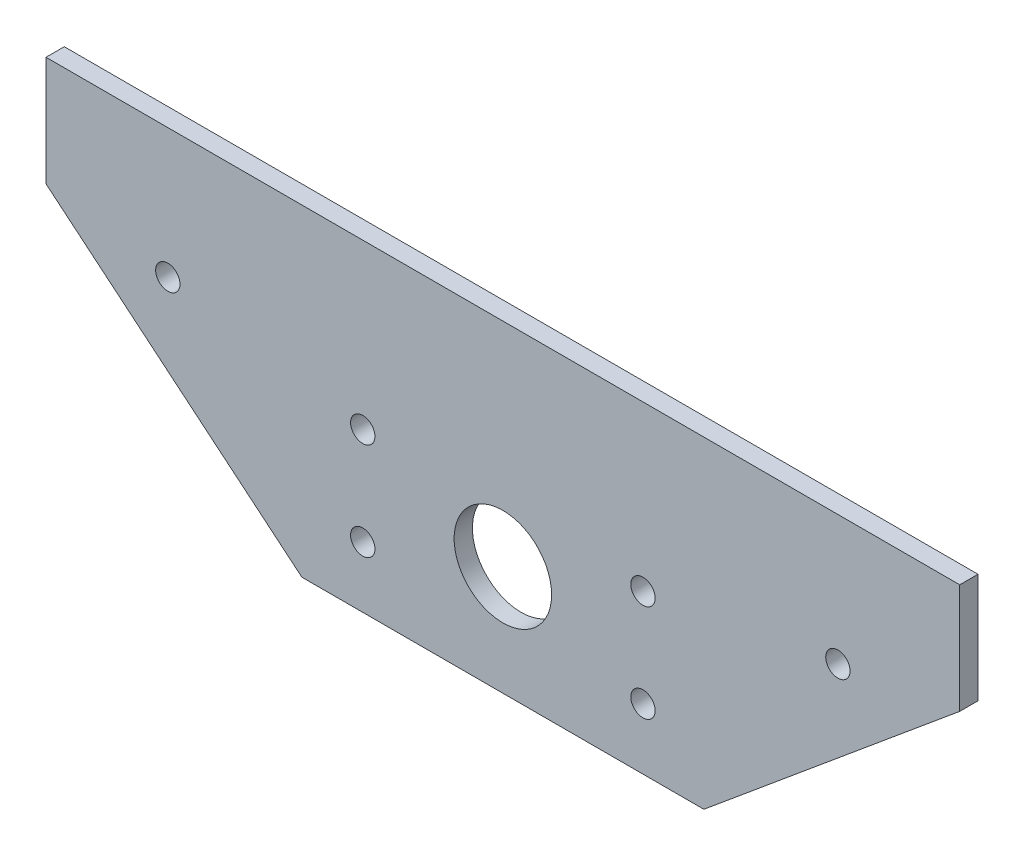
ISO-10303-21;
HEADER;
FILE_DESCRIPTION(('STEP AP214'),'2;1');
FILE_NAME('part.step','',(''),(''),'','','');
FILE_SCHEMA(('AUTOMOTIVE_DESIGN { 1 0 10303 214 1 1 1 1 }'));
ENDSEC;
DATA;
#1=APPLICATION_CONTEXT('core data for automotive mechanical design processes');
#2=APPLICATION_PROTOCOL_DEFINITION('international standard','automotive_design',2000,#1);
#3=PRODUCT_CONTEXT('',#1,'mechanical');
#4=PRODUCT('Part','Part','',(#3));
#5=PRODUCT_RELATED_PRODUCT_CATEGORY('part','',(#4));
#6=PRODUCT_DEFINITION_FORMATION('','',#4);
#7=PRODUCT_DEFINITION_CONTEXT('part definition',#1,'design');
#8=PRODUCT_DEFINITION('design','',#6,#7);
#9=PRODUCT_DEFINITION_SHAPE('','',#8);
#10=(LENGTH_UNIT() NAMED_UNIT(*) SI_UNIT(.MILLI.,.METRE.));
#11=(NAMED_UNIT(*) PLANE_ANGLE_UNIT() SI_UNIT($,.RADIAN.));
#12=(NAMED_UNIT(*) SI_UNIT($,.STERADIAN.) SOLID_ANGLE_UNIT());
#13=UNCERTAINTY_MEASURE_WITH_UNIT(LENGTH_MEASURE(1.E-05),#10,'distance_accuracy_value','');
#14=(GEOMETRIC_REPRESENTATION_CONTEXT(3) GLOBAL_UNCERTAINTY_ASSIGNED_CONTEXT((#13)) GLOBAL_UNIT_ASSIGNED_CONTEXT((#10,
#11,#12)) REPRESENTATION_CONTEXT('',''));
#15=CARTESIAN_POINT('',(0.,0.,0.));
#16=DIRECTION('',(0.,0.,1.));
#17=DIRECTION('',(1.,0.,0.));
#18=AXIS2_PLACEMENT_3D('',#15,#16,#17);
#19=CARTESIAN_POINT('',(0.,0.,3.));
#20=DIRECTION('',(0.,0.,1.));
#21=DIRECTION('',(1.,0.,0.));
#22=AXIS2_PLACEMENT_3D('',#19,#20,#21);
#23=PLANE('',#22);
#24=DIRECTION('',(-0.768948531530423,-0.639310688051753,0.));
#25=VECTOR('',#24,1.);
#26=CARTESIAN_POINT('',(75.,16.9191757278377,3.));
#27=LINE('',#26,#25);
#28=CARTESIAN_POINT('',(75.,16.9191757278377,3.));
#29=VERTEX_POINT('',#28);
#30=CARTESIAN_POINT('',(33.,-18.,3.));
#31=VERTEX_POINT('',#30);
#32=EDGE_CURVE('E183',#29,#31,#27,.T.);
#33=ORIENTED_EDGE('',*,*,#32,.F.);
#34=DIRECTION('',(0.,1.,0.));
#35=VECTOR('',#34,1.);
#36=CARTESIAN_POINT('',(75.,34.9191757278377,3.));
#37=LINE('',#36,#35);
#38=CARTESIAN_POINT('',(75.,34.9191757278377,3.));
#39=VERTEX_POINT('',#38);
#40=EDGE_CURVE('E101',#29,#39,#37,.T.);
#41=ORIENTED_EDGE('',*,*,#40,.T.);
#42=DIRECTION('',(-1.,0.,0.));
#43=VECTOR('',#42,1.);
#44=CARTESIAN_POINT('',(-75.,34.9191757278377,3.));
#45=LINE('',#44,#43);
#46=CARTESIAN_POINT('',(-75.,34.9191757278377,3.));
#47=VERTEX_POINT('',#46);
#48=EDGE_CURVE('E64',#39,#47,#45,.T.);
#49=ORIENTED_EDGE('',*,*,#48,.T.);
#50=DIRECTION('',(0.,-1.,0.));
#51=VECTOR('',#50,1.);
#52=CARTESIAN_POINT('',(-75.,34.9191757278377,3.));
#53=LINE('',#52,#51);
#54=CARTESIAN_POINT('',(-75.,16.9191757278377,3.));
#55=VERTEX_POINT('',#54);
#56=EDGE_CURVE('E92',#47,#55,#53,.T.);
#57=ORIENTED_EDGE('',*,*,#56,.T.);
#58=DIRECTION('',(-0.768948531530424,0.639310688051752,0.));
#59=VECTOR('',#58,1.);
#60=CARTESIAN_POINT('',(-75.,16.9191757278377,3.));
#61=LINE('',#60,#59);
#62=CARTESIAN_POINT('',(-33.,-18.,3.));
#63=VERTEX_POINT('',#62);
#64=EDGE_CURVE('E55',#63,#55,#61,.T.);
#65=ORIENTED_EDGE('',*,*,#64,.F.);
#66=DIRECTION('',(-1.,0.,0.));
#67=VECTOR('',#66,1.);
#68=CARTESIAN_POINT('',(-33.,-18.,3.));
#69=LINE('',#68,#67);
#70=EDGE_CURVE('E190',#31,#63,#69,.T.);
#71=ORIENTED_EDGE('',*,*,#70,.F.);
#72=EDGE_LOOP('',(#33,#41,#49,#57,#65,#71));
#73=FACE_BOUND('',#72,.T.);
#74=CARTESIAN_POINT('',(55.,13.6490091899119,3.));
#75=DIRECTION('',(0.,0.,1.));
#76=DIRECTION('',(-1.,0.,0.));
#77=AXIS2_PLACEMENT_3D('',#74,#75,#76);
#78=CIRCLE('',#77,2.);
#79=CARTESIAN_POINT('',(53.,13.6490091899119,3.));
#80=VERTEX_POINT('',#79);
#81=EDGE_CURVE('E161',#80,#80,#78,.T.);
#82=ORIENTED_EDGE('',*,*,#81,.F.);
#83=EDGE_LOOP('',(#82));
#84=FACE_BOUND('',#83,.T.);
#85=CARTESIAN_POINT('',(-55.,13.6490091899118,3.));
#86=DIRECTION('',(0.,0.,1.));
#87=DIRECTION('',(1.,0.,0.));
#88=AXIS2_PLACEMENT_3D('',#85,#86,#87);
#89=CIRCLE('',#88,2.);
#90=CARTESIAN_POINT('',(-53.,13.6490091899118,3.));
#91=VERTEX_POINT('',#90);
#92=EDGE_CURVE('E153',#91,#91,#89,.T.);
#93=ORIENTED_EDGE('',*,*,#92,.F.);
#94=EDGE_LOOP('',(#93));
#95=FACE_BOUND('',#94,.T.);
#96=CARTESIAN_POINT('',(-23.,-8.,3.));
#97=DIRECTION('',(0.,0.,-1.));
#98=DIRECTION('',(-1.,0.,0.));
#99=AXIS2_PLACEMENT_3D('',#96,#97,#98);
#100=CIRCLE('',#99,2.);
#101=CARTESIAN_POINT('',(-25.,-8.,3.));
#102=VERTEX_POINT('',#101);
#103=EDGE_CURVE('E125',#102,#102,#100,.T.);
#104=ORIENTED_EDGE('',*,*,#103,.T.);
#105=EDGE_LOOP('',(#104));
#106=FACE_BOUND('',#105,.T.);
#107=CARTESIAN_POINT('',(-23.,8.,3.));
#108=DIRECTION('',(0.,0.,1.));
#109=DIRECTION('',(1.,0.,0.));
#110=AXIS2_PLACEMENT_3D('',#107,#108,#109);
#111=CIRCLE('',#110,2.);
#112=CARTESIAN_POINT('',(-21.,8.,3.));
#113=VERTEX_POINT('',#112);
#114=EDGE_CURVE('E121',#113,#113,#111,.T.);
#115=ORIENTED_EDGE('',*,*,#114,.F.);
#116=EDGE_LOOP('',(#115));
#117=FACE_BOUND('',#116,.T.);
#118=CARTESIAN_POINT('',(0.,0.,3.));
#119=DIRECTION('',(0.,0.,1.));
#120=DIRECTION('',(1.,0.,0.));
#121=AXIS2_PLACEMENT_3D('',#118,#119,#120);
#122=CIRCLE('',#121,8.);
#123=CARTESIAN_POINT('',(8.,0.,3.));
#124=VERTEX_POINT('',#123);
#125=EDGE_CURVE('E113',#124,#124,#122,.T.);
#126=ORIENTED_EDGE('',*,*,#125,.F.);
#127=EDGE_LOOP('',(#126));
#128=FACE_BOUND('',#127,.T.);
#129=CARTESIAN_POINT('',(23.,-8.,3.));
#130=DIRECTION('',(0.,0.,1.));
#131=DIRECTION('',(1.,0.,0.));
#132=AXIS2_PLACEMENT_3D('',#129,#130,#131);
#133=CIRCLE('',#132,2.);
#134=CARTESIAN_POINT('',(25.,-8.,3.));
#135=VERTEX_POINT('',#134);
#136=EDGE_CURVE('E142',#135,#135,#133,.T.);
#137=ORIENTED_EDGE('',*,*,#136,.F.);
#138=EDGE_LOOP('',(#137));
#139=FACE_BOUND('',#138,.T.);
#140=CARTESIAN_POINT('',(23.,8.,3.));
#141=DIRECTION('',(0.,0.,-1.));
#142=DIRECTION('',(-1.,0.,0.));
#143=AXIS2_PLACEMENT_3D('',#140,#141,#142);
#144=CIRCLE('',#143,2.);
#145=CARTESIAN_POINT('',(21.,8.,3.));
#146=VERTEX_POINT('',#145);
#147=EDGE_CURVE('E133',#146,#146,#144,.T.);
#148=ORIENTED_EDGE('',*,*,#147,.T.);
#149=EDGE_LOOP('',(#148));
#150=FACE_BOUND('',#149,.T.);
#151=ADVANCED_FACE('F39',(#73,#84,#95,#106,#117,#128,#139,#150),#23,.T.);
#152=CARTESIAN_POINT('',(0.,0.,0.));
#153=DIRECTION('',(0.,0.,1.));
#154=DIRECTION('',(1.,0.,0.));
#155=AXIS2_PLACEMENT_3D('',#152,#153,#154);
#156=PLANE('',#155);
#157=CARTESIAN_POINT('',(55.,13.6490091899119,0.));
#158=DIRECTION('',(0.,0.,1.));
#159=DIRECTION('',(-1.,0.,0.));
#160=AXIS2_PLACEMENT_3D('',#157,#158,#159);
#161=CIRCLE('',#160,2.);
#162=CARTESIAN_POINT('',(53.,13.6490091899119,0.));
#163=VERTEX_POINT('',#162);
#164=EDGE_CURVE('E157',#163,#163,#161,.T.);
#165=ORIENTED_EDGE('',*,*,#164,.T.);
#166=EDGE_LOOP('',(#165));
#167=FACE_BOUND('',#166,.T.);
#168=CARTESIAN_POINT('',(-55.,13.6490091899118,0.));
#169=DIRECTION('',(0.,0.,1.));
#170=DIRECTION('',(1.,0.,0.));
#171=AXIS2_PLACEMENT_3D('',#168,#169,#170);
#172=CIRCLE('',#171,2.);
#173=CARTESIAN_POINT('',(-53.,13.6490091899118,0.));
#174=VERTEX_POINT('',#173);
#175=EDGE_CURVE('E134',#174,#174,#172,.T.);
#176=ORIENTED_EDGE('',*,*,#175,.T.);
#177=EDGE_LOOP('',(#176));
#178=FACE_BOUND('',#177,.T.);
#179=CARTESIAN_POINT('',(23.,-8.,0.));
#180=DIRECTION('',(0.,0.,1.));
#181=DIRECTION('',(1.,0.,0.));
#182=AXIS2_PLACEMENT_3D('',#179,#180,#181);
#183=CIRCLE('',#182,2.);
#184=CARTESIAN_POINT('',(25.,-8.,0.));
#185=VERTEX_POINT('',#184);
#186=EDGE_CURVE('E138',#185,#185,#183,.T.);
#187=ORIENTED_EDGE('',*,*,#186,.T.);
#188=EDGE_LOOP('',(#187));
#189=FACE_BOUND('',#188,.T.);
#190=CARTESIAN_POINT('',(-23.,8.,0.));
#191=DIRECTION('',(0.,0.,1.));
#192=DIRECTION('',(1.,0.,0.));
#193=AXIS2_PLACEMENT_3D('',#190,#191,#192);
#194=CIRCLE('',#193,2.);
#195=CARTESIAN_POINT('',(-21.,8.,0.));
#196=VERTEX_POINT('',#195);
#197=EDGE_CURVE('E117',#196,#196,#194,.T.);
#198=ORIENTED_EDGE('',*,*,#197,.T.);
#199=EDGE_LOOP('',(#198));
#200=FACE_BOUND('',#199,.T.);
#201=CARTESIAN_POINT('',(0.,0.,0.));
#202=DIRECTION('',(0.,0.,1.));
#203=DIRECTION('',(1.,0.,0.));
#204=AXIS2_PLACEMENT_3D('',#201,#202,#203);
#205=CIRCLE('',#204,8.);
#206=CARTESIAN_POINT('',(8.,0.,0.));
#207=VERTEX_POINT('',#206);
#208=EDGE_CURVE('E108',#207,#207,#205,.T.);
#209=ORIENTED_EDGE('',*,*,#208,.T.);
#210=EDGE_LOOP('',(#209));
#211=FACE_BOUND('',#210,.T.);
#212=DIRECTION('',(0.,1.,0.));
#213=VECTOR('',#212,1.);
#214=CARTESIAN_POINT('',(75.,34.9191757278377,0.));
#215=LINE('',#214,#213);
#216=CARTESIAN_POINT('',(75.,16.9191757278377,0.));
#217=VERTEX_POINT('',#216);
#218=CARTESIAN_POINT('',(75.,34.9191757278377,0.));
#219=VERTEX_POINT('',#218);
#220=EDGE_CURVE('E86',#217,#219,#215,.T.);
#221=ORIENTED_EDGE('',*,*,#220,.F.);
#222=DIRECTION('',(-0.768948531530423,-0.639310688051753,0.));
#223=VECTOR('',#222,1.);
#224=CARTESIAN_POINT('',(75.,16.9191757278377,0.));
#225=LINE('',#224,#223);
#226=CARTESIAN_POINT('',(33.,-18.,0.));
#227=VERTEX_POINT('',#226);
#228=EDGE_CURVE('E173',#217,#227,#225,.T.);
#229=ORIENTED_EDGE('',*,*,#228,.T.);
#230=DIRECTION('',(-1.,0.,0.));
#231=VECTOR('',#230,1.);
#232=CARTESIAN_POINT('',(-33.,-18.,0.));
#233=LINE('',#232,#231);
#234=CARTESIAN_POINT('',(-33.,-18.,0.));
#235=VERTEX_POINT('',#234);
#236=EDGE_CURVE('E187',#227,#235,#233,.T.);
#237=ORIENTED_EDGE('',*,*,#236,.T.);
#238=DIRECTION('',(-0.768948531530424,0.639310688051752,0.));
#239=VECTOR('',#238,1.);
#240=CARTESIAN_POINT('',(-75.,16.9191757278377,0.));
#241=LINE('',#240,#239);
#242=CARTESIAN_POINT('',(-75.,16.9191757278377,0.));
#243=VERTEX_POINT('',#242);
#244=EDGE_CURVE('E99',#235,#243,#241,.T.);
#245=ORIENTED_EDGE('',*,*,#244,.T.);
#246=DIRECTION('',(0.,-1.,0.));
#247=VECTOR('',#246,1.);
#248=CARTESIAN_POINT('',(-75.,34.9191757278377,0.));
#249=LINE('',#248,#247);
#250=CARTESIAN_POINT('',(-75.,34.9191757278377,0.));
#251=VERTEX_POINT('',#250);
#252=EDGE_CURVE('E85',#251,#243,#249,.T.);
#253=ORIENTED_EDGE('',*,*,#252,.F.);
#254=DIRECTION('',(-1.,0.,0.));
#255=VECTOR('',#254,1.);
#256=CARTESIAN_POINT('',(-75.,34.9191757278377,0.));
#257=LINE('',#256,#255);
#258=EDGE_CURVE('E76',#219,#251,#257,.T.);
#259=ORIENTED_EDGE('',*,*,#258,.F.);
#260=EDGE_LOOP('',(#221,#229,#237,#245,#253,#259));
#261=FACE_BOUND('',#260,.T.);
#262=CARTESIAN_POINT('',(-23.,-8.,0.));
#263=DIRECTION('',(0.,0.,-1.));
#264=DIRECTION('',(-1.,0.,0.));
#265=AXIS2_PLACEMENT_3D('',#262,#263,#264);
#266=CIRCLE('',#265,2.);
#267=CARTESIAN_POINT('',(-25.,-8.,0.));
#268=VERTEX_POINT('',#267);
#269=EDGE_CURVE('E146',#268,#268,#266,.T.);
#270=ORIENTED_EDGE('',*,*,#269,.F.);
#271=EDGE_LOOP('',(#270));
#272=FACE_BOUND('',#271,.T.);
#273=CARTESIAN_POINT('',(23.,8.,0.));
#274=DIRECTION('',(0.,0.,-1.));
#275=DIRECTION('',(-1.,0.,0.));
#276=AXIS2_PLACEMENT_3D('',#273,#274,#275);
#277=CIRCLE('',#276,2.);
#278=CARTESIAN_POINT('',(21.,8.,0.));
#279=VERTEX_POINT('',#278);
#280=EDGE_CURVE('E129',#279,#279,#277,.T.);
#281=ORIENTED_EDGE('',*,*,#280,.F.);
#282=EDGE_LOOP('',(#281));
#283=FACE_BOUND('',#282,.T.);
#284=ADVANCED_FACE('F95',(#167,#178,#189,#200,#211,#261,#272,#283),#156,.F.);
#285=CARTESIAN_POINT('',(75.,34.9191757278377,3.));
#286=DIRECTION('',(-1.,0.,0.));
#287=DIRECTION('',(0.,-1.,0.));
#288=AXIS2_PLACEMENT_3D('',#285,#286,#287);
#289=PLANE('',#288);
#290=ORIENTED_EDGE('',*,*,#40,.F.);
#291=DIRECTION('',(0.,0.,1.));
#292=VECTOR('',#291,1.);
#293=CARTESIAN_POINT('',(75.,16.9191757278377,0.));
#294=LINE('',#293,#292);
#295=EDGE_CURVE('E176',#217,#29,#294,.T.);
#296=ORIENTED_EDGE('',*,*,#295,.F.);
#297=ORIENTED_EDGE('',*,*,#220,.T.);
#298=DIRECTION('',(0.,0.,-1.));
#299=VECTOR('',#298,1.);
#300=CARTESIAN_POINT('',(75.,34.9191757278377,3.));
#301=LINE('',#300,#299);
#302=EDGE_CURVE('E11',#39,#219,#301,.T.);
#303=ORIENTED_EDGE('',*,*,#302,.F.);
#304=EDGE_LOOP('',(#290,#296,#297,#303));
#305=FACE_BOUND('',#304,.T.);
#306=ADVANCED_FACE('F41',(#305),#289,.F.);
#307=CARTESIAN_POINT('',(-75.,34.9191757278377,3.));
#308=DIRECTION('',(0.,-1.,0.));
#309=DIRECTION('',(0.,0.,-1.));
#310=AXIS2_PLACEMENT_3D('',#307,#308,#309);
#311=PLANE('',#310);
#312=ORIENTED_EDGE('',*,*,#258,.T.);
#313=DIRECTION('',(0.,0.,-1.));
#314=VECTOR('',#313,1.);
#315=CARTESIAN_POINT('',(-75.,34.9191757278377,3.));
#316=LINE('',#315,#314);
#317=EDGE_CURVE('E48',#47,#251,#316,.T.);
#318=ORIENTED_EDGE('',*,*,#317,.F.);
#319=ORIENTED_EDGE('',*,*,#48,.F.);
#320=ORIENTED_EDGE('',*,*,#302,.T.);
#321=EDGE_LOOP('',(#312,#318,#319,#320));
#322=FACE_BOUND('',#321,.T.);
#323=ADVANCED_FACE('F78',(#322),#311,.F.);
#324=CARTESIAN_POINT('',(-75.,34.9191757278377,3.));
#325=DIRECTION('',(1.,0.,0.));
#326=DIRECTION('',(0.,0.,-1.));
#327=AXIS2_PLACEMENT_3D('',#324,#325,#326);
#328=PLANE('',#327);
#329=ORIENTED_EDGE('',*,*,#252,.T.);
#330=DIRECTION('',(0.,0.,1.));
#331=VECTOR('',#330,1.);
#332=CARTESIAN_POINT('',(-75.,16.9191757278377,0.));
#333=LINE('',#332,#331);
#334=EDGE_CURVE('E172',#243,#55,#333,.T.);
#335=ORIENTED_EDGE('',*,*,#334,.T.);
#336=ORIENTED_EDGE('',*,*,#56,.F.);
#337=ORIENTED_EDGE('',*,*,#317,.T.);
#338=EDGE_LOOP('',(#329,#335,#336,#337));
#339=FACE_BOUND('',#338,.T.);
#340=ADVANCED_FACE('F90',(#339),#328,.F.);
#341=CARTESIAN_POINT('',(0.,0.,0.));
#342=DIRECTION('',(0.,0.,1.));
#343=DIRECTION('',(1.,0.,0.));
#344=AXIS2_PLACEMENT_3D('',#341,#342,#343);
#345=CYLINDRICAL_SURFACE('',#344,8.);
#346=ORIENTED_EDGE('',*,*,#208,.F.);
#347=EDGE_LOOP('',(#346));
#348=FACE_BOUND('',#347,.T.);
#349=ORIENTED_EDGE('',*,*,#125,.T.);
#350=EDGE_LOOP('',(#349));
#351=FACE_BOUND('',#350,.T.);
#352=ADVANCED_FACE('F237',(#348,#351),#345,.F.);
#353=CARTESIAN_POINT('',(-23.,8.,0.));
#354=DIRECTION('',(0.,0.,1.));
#355=DIRECTION('',(1.,0.,0.));
#356=AXIS2_PLACEMENT_3D('',#353,#354,#355);
#357=CYLINDRICAL_SURFACE('',#356,2.);
#358=ORIENTED_EDGE('',*,*,#197,.F.);
#359=EDGE_LOOP('',(#358));
#360=FACE_BOUND('',#359,.T.);
#361=ORIENTED_EDGE('',*,*,#114,.T.);
#362=EDGE_LOOP('',(#361));
#363=FACE_BOUND('',#362,.T.);
#364=ADVANCED_FACE('F244',(#360,#363),#357,.F.);
#365=CARTESIAN_POINT('',(-23.,-8.,0.));
#366=DIRECTION('',(0.,0.,1.));
#367=DIRECTION('',(1.,0.,0.));
#368=AXIS2_PLACEMENT_3D('',#365,#366,#367);
#369=CYLINDRICAL_SURFACE('',#368,2.);
#370=ORIENTED_EDGE('',*,*,#269,.T.);
#371=EDGE_LOOP('',(#370));
#372=FACE_BOUND('',#371,.T.);
#373=ORIENTED_EDGE('',*,*,#103,.F.);
#374=EDGE_LOOP('',(#373));
#375=FACE_BOUND('',#374,.T.);
#376=ADVANCED_FACE('F249',(#372,#375),#369,.F.);
#377=CARTESIAN_POINT('',(23.,-8.,0.));
#378=DIRECTION('',(0.,0.,1.));
#379=DIRECTION('',(1.,0.,0.));
#380=AXIS2_PLACEMENT_3D('',#377,#378,#379);
#381=CYLINDRICAL_SURFACE('',#380,2.);
#382=ORIENTED_EDGE('',*,*,#186,.F.);
#383=EDGE_LOOP('',(#382));
#384=FACE_BOUND('',#383,.T.);
#385=ORIENTED_EDGE('',*,*,#136,.T.);
#386=EDGE_LOOP('',(#385));
#387=FACE_BOUND('',#386,.T.);
#388=ADVANCED_FACE('F263',(#384,#387),#381,.F.);
#389=CARTESIAN_POINT('',(23.,8.,0.));
#390=DIRECTION('',(0.,0.,1.));
#391=DIRECTION('',(1.,0.,0.));
#392=AXIS2_PLACEMENT_3D('',#389,#390,#391);
#393=CYLINDRICAL_SURFACE('',#392,2.);
#394=ORIENTED_EDGE('',*,*,#280,.T.);
#395=EDGE_LOOP('',(#394));
#396=FACE_BOUND('',#395,.T.);
#397=ORIENTED_EDGE('',*,*,#147,.F.);
#398=EDGE_LOOP('',(#397));
#399=FACE_BOUND('',#398,.T.);
#400=ADVANCED_FACE('F260',(#396,#399),#393,.F.);
#401=CARTESIAN_POINT('',(-55.,13.6490091899118,0.));
#402=DIRECTION('',(0.,0.,1.));
#403=DIRECTION('',(1.,0.,0.));
#404=AXIS2_PLACEMENT_3D('',#401,#402,#403);
#405=CYLINDRICAL_SURFACE('',#404,2.);
#406=ORIENTED_EDGE('',*,*,#175,.F.);
#407=EDGE_LOOP('',(#406));
#408=FACE_BOUND('',#407,.T.);
#409=ORIENTED_EDGE('',*,*,#92,.T.);
#410=EDGE_LOOP('',(#409));
#411=FACE_BOUND('',#410,.T.);
#412=ADVANCED_FACE('F262',(#408,#411),#405,.F.);
#413=CARTESIAN_POINT('',(55.,13.6490091899119,0.));
#414=DIRECTION('',(0.,0.,1.));
#415=DIRECTION('',(1.,0.,0.));
#416=AXIS2_PLACEMENT_3D('',#413,#414,#415);
#417=CYLINDRICAL_SURFACE('',#416,2.);
#418=ORIENTED_EDGE('',*,*,#164,.F.);
#419=EDGE_LOOP('',(#418));
#420=FACE_BOUND('',#419,.T.);
#421=ORIENTED_EDGE('',*,*,#81,.T.);
#422=EDGE_LOOP('',(#421));
#423=FACE_BOUND('',#422,.T.);
#424=ADVANCED_FACE('F270',(#420,#423),#417,.F.);
#425=CARTESIAN_POINT('',(-33.,-18.,0.));
#426=DIRECTION('',(0.,1.,0.));
#427=DIRECTION('',(0.,0.,1.));
#428=AXIS2_PLACEMENT_3D('',#425,#426,#427);
#429=PLANE('',#428);
#430=ORIENTED_EDGE('',*,*,#70,.T.);
#431=DIRECTION('',(0.,0.,1.));
#432=VECTOR('',#431,1.);
#433=CARTESIAN_POINT('',(-33.,-18.,0.));
#434=LINE('',#433,#432);
#435=EDGE_CURVE('E169',#235,#63,#434,.T.);
#436=ORIENTED_EDGE('',*,*,#435,.F.);
#437=ORIENTED_EDGE('',*,*,#236,.F.);
#438=DIRECTION('',(0.,0.,1.));
#439=VECTOR('',#438,1.);
#440=CARTESIAN_POINT('',(33.,-18.,0.));
#441=LINE('',#440,#439);
#442=EDGE_CURVE('E165',#227,#31,#441,.T.);
#443=ORIENTED_EDGE('',*,*,#442,.T.);
#444=EDGE_LOOP('',(#430,#436,#437,#443));
#445=FACE_BOUND('',#444,.T.);
#446=ADVANCED_FACE('F207',(#445),#429,.F.);
#447=CARTESIAN_POINT('',(75.,16.9191757278377,0.));
#448=DIRECTION('',(-0.639310688051753,0.768948531530423,0.));
#449=DIRECTION('',(-0.768948531530423,-0.639310688051753,0.));
#450=AXIS2_PLACEMENT_3D('',#447,#448,#449);
#451=PLANE('',#450);
#452=ORIENTED_EDGE('',*,*,#32,.T.);
#453=ORIENTED_EDGE('',*,*,#442,.F.);
#454=ORIENTED_EDGE('',*,*,#228,.F.);
#455=ORIENTED_EDGE('',*,*,#295,.T.);
#456=EDGE_LOOP('',(#452,#453,#454,#455));
#457=FACE_BOUND('',#456,.T.);
#458=ADVANCED_FACE('F220',(#457),#451,.F.);
#459=CARTESIAN_POINT('',(-75.,16.9191757278377,0.));
#460=DIRECTION('',(0.639310688051752,0.768948531530424,0.));
#461=DIRECTION('',(-0.768948531530424,0.639310688051752,0.));
#462=AXIS2_PLACEMENT_3D('',#459,#460,#461);
#463=PLANE('',#462);
#464=ORIENTED_EDGE('',*,*,#64,.T.);
#465=ORIENTED_EDGE('',*,*,#334,.F.);
#466=ORIENTED_EDGE('',*,*,#244,.F.);
#467=ORIENTED_EDGE('',*,*,#435,.T.);
#468=EDGE_LOOP('',(#464,#465,#466,#467));
#469=FACE_BOUND('',#468,.T.);
#470=ADVANCED_FACE('F284',(#469),#463,.F.);
#471=CLOSED_SHELL('',(#151,#284,#306,#323,#340,#352,#364,#376,#388,#400,#412,#424,#446,#458,#470));
#472=MANIFOLD_SOLID_BREP('B2',#471);
#473=ADVANCED_BREP_SHAPE_REPRESENTATION('',(#18,#472),#14);
#474=SHAPE_DEFINITION_REPRESENTATION(#9,#473);
ENDSEC;
END-ISO-10303-21;
